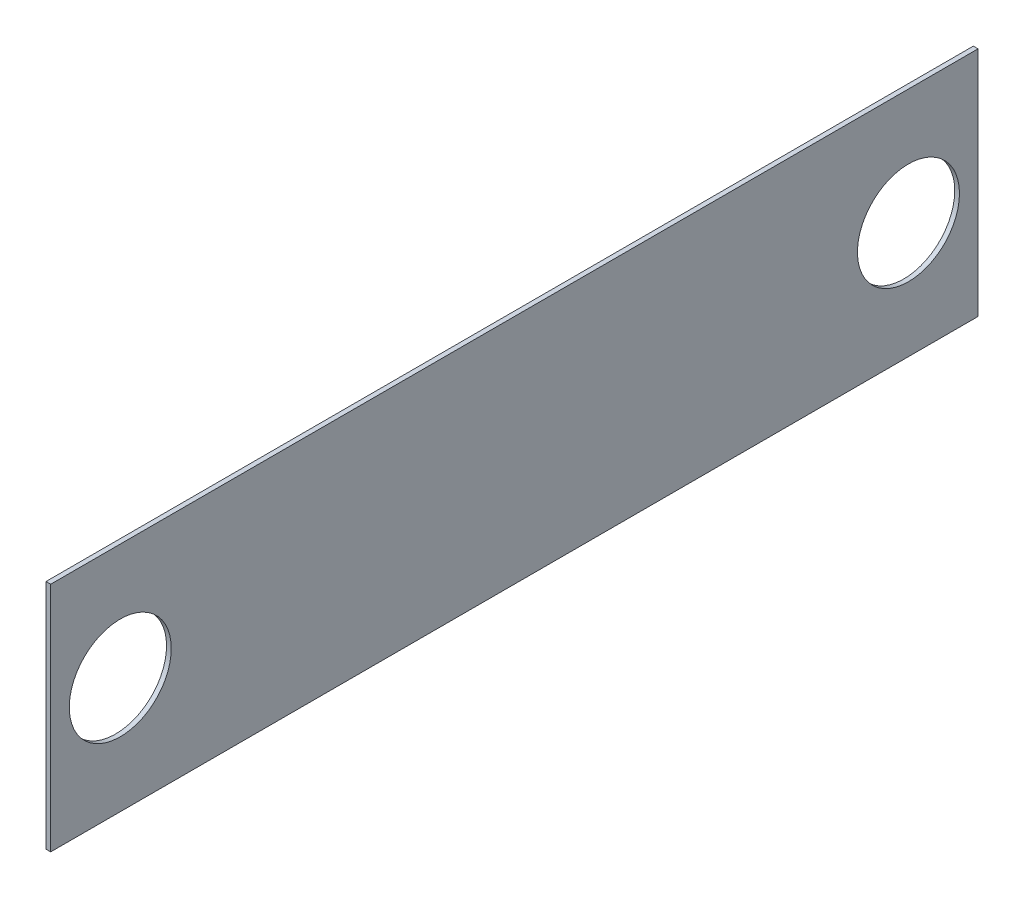
ISO-10303-21;
HEADER;
FILE_DESCRIPTION(('STEP AP214'),'2;1');
FILE_NAME('part.step','',(''),(''),'','','');
FILE_SCHEMA(('AUTOMOTIVE_DESIGN { 1 0 10303 214 1 1 1 1 }'));
ENDSEC;
DATA;
#1=APPLICATION_CONTEXT('core data for automotive mechanical design processes');
#2=APPLICATION_PROTOCOL_DEFINITION('international standard','automotive_design',2000,#1);
#3=PRODUCT_CONTEXT('',#1,'mechanical');
#4=PRODUCT('Part','Part','',(#3));
#5=PRODUCT_RELATED_PRODUCT_CATEGORY('part','',(#4));
#6=PRODUCT_DEFINITION_FORMATION('','',#4);
#7=PRODUCT_DEFINITION_CONTEXT('part definition',#1,'design');
#8=PRODUCT_DEFINITION('design','',#6,#7);
#9=PRODUCT_DEFINITION_SHAPE('','',#8);
#10=(LENGTH_UNIT() NAMED_UNIT(*) SI_UNIT(.MILLI.,.METRE.));
#11=(NAMED_UNIT(*) PLANE_ANGLE_UNIT() SI_UNIT($,.RADIAN.));
#12=(NAMED_UNIT(*) SI_UNIT($,.STERADIAN.) SOLID_ANGLE_UNIT());
#13=UNCERTAINTY_MEASURE_WITH_UNIT(LENGTH_MEASURE(1.E-05),#10,'distance_accuracy_value','');
#14=(GEOMETRIC_REPRESENTATION_CONTEXT(3) GLOBAL_UNCERTAINTY_ASSIGNED_CONTEXT((#13)) GLOBAL_UNIT_ASSIGNED_CONTEXT((#10,
#11,#12)) REPRESENTATION_CONTEXT('',''));
#15=CARTESIAN_POINT('',(0.,0.,0.));
#16=DIRECTION('',(0.,0.,1.));
#17=DIRECTION('',(1.,0.,0.));
#18=AXIS2_PLACEMENT_3D('',#15,#16,#17);
#19=CARTESIAN_POINT('',(0.508,12.5,50.));
#20=DIRECTION('',(0.,0.,-1.));
#21=DIRECTION('',(-1.,0.,0.));
#22=AXIS2_PLACEMENT_3D('',#19,#20,#21);
#23=PLANE('',#22);
#24=DIRECTION('',(0.,-1.,0.));
#25=VECTOR('',#24,1.);
#26=CARTESIAN_POINT('',(0.,12.5,50.));
#27=LINE('',#26,#25);
#28=CARTESIAN_POINT('',(0.,12.5,50.));
#29=VERTEX_POINT('',#28);
#30=CARTESIAN_POINT('',(0.,-12.5,50.));
#31=VERTEX_POINT('',#30);
#32=EDGE_CURVE('E97',#29,#31,#27,.T.);
#33=ORIENTED_EDGE('',*,*,#32,.T.);
#34=DIRECTION('',(-1.,0.,0.));
#35=VECTOR('',#34,1.);
#36=CARTESIAN_POINT('',(0.508,-12.5,50.));
#37=LINE('',#36,#35);
#38=CARTESIAN_POINT('',(0.508,-12.5,50.));
#39=VERTEX_POINT('',#38);
#40=EDGE_CURVE('E11',#39,#31,#37,.T.);
#41=ORIENTED_EDGE('',*,*,#40,.F.);
#42=DIRECTION('',(0.,-1.,0.));
#43=VECTOR('',#42,1.);
#44=CARTESIAN_POINT('',(0.508,12.5,50.));
#45=LINE('',#44,#43);
#46=CARTESIAN_POINT('',(0.508,12.5,50.));
#47=VERTEX_POINT('',#46);
#48=EDGE_CURVE('E85',#47,#39,#45,.T.);
#49=ORIENTED_EDGE('',*,*,#48,.F.);
#50=DIRECTION('',(-1.,0.,0.));
#51=VECTOR('',#50,1.);
#52=CARTESIAN_POINT('',(0.508,12.5,50.));
#53=LINE('',#52,#51);
#54=EDGE_CURVE('E93',#47,#29,#53,.T.);
#55=ORIENTED_EDGE('',*,*,#54,.T.);
#56=EDGE_LOOP('',(#33,#41,#49,#55));
#57=FACE_BOUND('',#56,.T.);
#58=ADVANCED_FACE('F34',(#57),#23,.F.);
#59=CARTESIAN_POINT('',(0.508,-12.5,50.));
#60=DIRECTION('',(0.,1.,0.));
#61=DIRECTION('',(0.,0.,1.));
#62=AXIS2_PLACEMENT_3D('',#59,#60,#61);
#63=PLANE('',#62);
#64=DIRECTION('',(0.,0.,-1.));
#65=VECTOR('',#64,1.);
#66=CARTESIAN_POINT('',(0.,-12.5,50.));
#67=LINE('',#66,#65);
#68=CARTESIAN_POINT('',(0.,-12.5,-50.));
#69=VERTEX_POINT('',#68);
#70=EDGE_CURVE('E89',#31,#69,#67,.T.);
#71=ORIENTED_EDGE('',*,*,#70,.T.);
#72=DIRECTION('',(-1.,0.,0.));
#73=VECTOR('',#72,1.);
#74=CARTESIAN_POINT('',(0.508,-12.5,-50.));
#75=LINE('',#74,#73);
#76=CARTESIAN_POINT('',(0.508,-12.5,-50.));
#77=VERTEX_POINT('',#76);
#78=EDGE_CURVE('E42',#77,#69,#75,.T.);
#79=ORIENTED_EDGE('',*,*,#78,.F.);
#80=DIRECTION('',(0.,0.,-1.));
#81=VECTOR('',#80,1.);
#82=CARTESIAN_POINT('',(0.508,-12.5,50.));
#83=LINE('',#82,#81);
#84=EDGE_CURVE('E80',#39,#77,#83,.T.);
#85=ORIENTED_EDGE('',*,*,#84,.F.);
#86=ORIENTED_EDGE('',*,*,#40,.T.);
#87=EDGE_LOOP('',(#71,#79,#85,#86));
#88=FACE_BOUND('',#87,.T.);
#89=ADVANCED_FACE('F88',(#88),#63,.F.);
#90=CARTESIAN_POINT('',(0.508,12.5,-50.));
#91=DIRECTION('',(0.,0.,1.));
#92=DIRECTION('',(1.,0.,0.));
#93=AXIS2_PLACEMENT_3D('',#90,#91,#92);
#94=PLANE('',#93);
#95=DIRECTION('',(0.,1.,0.));
#96=VECTOR('',#95,1.);
#97=CARTESIAN_POINT('',(0.,12.5,-50.));
#98=LINE('',#97,#96);
#99=CARTESIAN_POINT('',(0.,12.5,-50.));
#100=VERTEX_POINT('',#99);
#101=EDGE_CURVE('E67',#69,#100,#98,.T.);
#102=ORIENTED_EDGE('',*,*,#101,.T.);
#103=DIRECTION('',(-1.,0.,0.));
#104=VECTOR('',#103,1.);
#105=CARTESIAN_POINT('',(0.508,12.5,-50.));
#106=LINE('',#105,#104);
#107=CARTESIAN_POINT('',(0.508,12.5,-50.));
#108=VERTEX_POINT('',#107);
#109=EDGE_CURVE('E90',#108,#100,#106,.T.);
#110=ORIENTED_EDGE('',*,*,#109,.F.);
#111=DIRECTION('',(0.,1.,0.));
#112=VECTOR('',#111,1.);
#113=CARTESIAN_POINT('',(0.508,12.5,-50.));
#114=LINE('',#113,#112);
#115=EDGE_CURVE('E83',#77,#108,#114,.T.);
#116=ORIENTED_EDGE('',*,*,#115,.F.);
#117=ORIENTED_EDGE('',*,*,#78,.T.);
#118=EDGE_LOOP('',(#102,#110,#116,#117));
#119=FACE_BOUND('',#118,.T.);
#120=ADVANCED_FACE('F91',(#119),#94,.F.);
#121=CARTESIAN_POINT('',(0.508,12.5,50.));
#122=DIRECTION('',(0.,-1.,0.));
#123=DIRECTION('',(0.,0.,-1.));
#124=AXIS2_PLACEMENT_3D('',#121,#122,#123);
#125=PLANE('',#124);
#126=DIRECTION('',(0.,0.,1.));
#127=VECTOR('',#126,1.);
#128=CARTESIAN_POINT('',(0.,12.5,50.));
#129=LINE('',#128,#127);
#130=EDGE_CURVE('E73',#100,#29,#129,.T.);
#131=ORIENTED_EDGE('',*,*,#130,.T.);
#132=ORIENTED_EDGE('',*,*,#54,.F.);
#133=DIRECTION('',(0.,0.,1.));
#134=VECTOR('',#133,1.);
#135=CARTESIAN_POINT('',(0.508,12.5,50.));
#136=LINE('',#135,#134);
#137=EDGE_CURVE('E50',#108,#47,#136,.T.);
#138=ORIENTED_EDGE('',*,*,#137,.F.);
#139=ORIENTED_EDGE('',*,*,#109,.T.);
#140=EDGE_LOOP('',(#131,#132,#138,#139));
#141=FACE_BOUND('',#140,.T.);
#142=ADVANCED_FACE('F105',(#141),#125,.F.);
#143=CARTESIAN_POINT('',(0.508,0.,0.));
#144=DIRECTION('',(1.,0.,0.));
#145=DIRECTION('',(0.,0.,-1.));
#146=AXIS2_PLACEMENT_3D('',#143,#144,#145);
#147=PLANE('',#146);
#148=CARTESIAN_POINT('',(0.508000000000001,0.,42.5));
#149=DIRECTION('',(1.,0.,0.));
#150=DIRECTION('',(0.,0.,-1.));
#151=AXIS2_PLACEMENT_3D('',#148,#149,#150);
#152=CIRCLE('',#151,5.5);
#153=CARTESIAN_POINT('',(0.508000000000001,0.,37.));
#154=VERTEX_POINT('',#153);
#155=EDGE_CURVE('E119',#154,#154,#152,.T.);
#156=ORIENTED_EDGE('',*,*,#155,.F.);
#157=EDGE_LOOP('',(#156));
#158=FACE_BOUND('',#157,.T.);
#159=CARTESIAN_POINT('',(0.508000000000001,0.,-42.5));
#160=DIRECTION('',(1.,0.,0.));
#161=DIRECTION('',(0.,0.,-1.));
#162=AXIS2_PLACEMENT_3D('',#159,#160,#161);
#163=CIRCLE('',#162,5.5);
#164=CARTESIAN_POINT('',(0.508000000000001,0.,-48.));
#165=VERTEX_POINT('',#164);
#166=EDGE_CURVE('E113',#165,#165,#163,.T.);
#167=ORIENTED_EDGE('',*,*,#166,.F.);
#168=EDGE_LOOP('',(#167));
#169=FACE_BOUND('',#168,.T.);
#170=ORIENTED_EDGE('',*,*,#48,.T.);
#171=ORIENTED_EDGE('',*,*,#84,.T.);
#172=ORIENTED_EDGE('',*,*,#115,.T.);
#173=ORIENTED_EDGE('',*,*,#137,.T.);
#174=EDGE_LOOP('',(#170,#171,#172,#173));
#175=FACE_BOUND('',#174,.T.);
#176=ADVANCED_FACE('F81',(#158,#169,#175),#147,.T.);
#177=CARTESIAN_POINT('',(0.,0.,0.));
#178=DIRECTION('',(1.,0.,0.));
#179=DIRECTION('',(0.,0.,-1.));
#180=AXIS2_PLACEMENT_3D('',#177,#178,#179);
#181=PLANE('',#180);
#182=CARTESIAN_POINT('',(0.,0.,42.5));
#183=DIRECTION('',(1.,0.,0.));
#184=DIRECTION('',(0.,0.,-1.));
#185=AXIS2_PLACEMENT_3D('',#182,#183,#184);
#186=CIRCLE('',#185,5.5);
#187=CARTESIAN_POINT('',(0.,0.,37.));
#188=VERTEX_POINT('',#187);
#189=EDGE_CURVE('E116',#188,#188,#186,.T.);
#190=ORIENTED_EDGE('',*,*,#189,.T.);
#191=EDGE_LOOP('',(#190));
#192=FACE_BOUND('',#191,.T.);
#193=CARTESIAN_POINT('',(0.,0.,-42.5));
#194=DIRECTION('',(1.,0.,0.));
#195=DIRECTION('',(0.,0.,-1.));
#196=AXIS2_PLACEMENT_3D('',#193,#194,#195);
#197=CIRCLE('',#196,5.5);
#198=CARTESIAN_POINT('',(0.,0.,-48.));
#199=VERTEX_POINT('',#198);
#200=EDGE_CURVE('E100',#199,#199,#197,.T.);
#201=ORIENTED_EDGE('',*,*,#200,.T.);
#202=EDGE_LOOP('',(#201));
#203=FACE_BOUND('',#202,.T.);
#204=ORIENTED_EDGE('',*,*,#32,.F.);
#205=ORIENTED_EDGE('',*,*,#130,.F.);
#206=ORIENTED_EDGE('',*,*,#101,.F.);
#207=ORIENTED_EDGE('',*,*,#70,.F.);
#208=EDGE_LOOP('',(#204,#205,#206,#207));
#209=FACE_BOUND('',#208,.T.);
#210=ADVANCED_FACE('F108',(#192,#203,#209),#181,.F.);
#211=CARTESIAN_POINT('',(0.508,0.,-42.5));
#212=DIRECTION('',(1.,0.,0.));
#213=DIRECTION('',(0.,0.,-1.));
#214=AXIS2_PLACEMENT_3D('',#211,#212,#213);
#215=CYLINDRICAL_SURFACE('',#214,5.5);
#216=ORIENTED_EDGE('',*,*,#200,.F.);
#217=EDGE_LOOP('',(#216));
#218=FACE_BOUND('',#217,.T.);
#219=ORIENTED_EDGE('',*,*,#166,.T.);
#220=EDGE_LOOP('',(#219));
#221=FACE_BOUND('',#220,.T.);
#222=ADVANCED_FACE('F130',(#218,#221),#215,.F.);
#223=CARTESIAN_POINT('',(0.508,0.,42.5));
#224=DIRECTION('',(1.,0.,0.));
#225=DIRECTION('',(0.,0.,-1.));
#226=AXIS2_PLACEMENT_3D('',#223,#224,#225);
#227=CYLINDRICAL_SURFACE('',#226,5.5);
#228=ORIENTED_EDGE('',*,*,#189,.F.);
#229=EDGE_LOOP('',(#228));
#230=FACE_BOUND('',#229,.T.);
#231=ORIENTED_EDGE('',*,*,#155,.T.);
#232=EDGE_LOOP('',(#231));
#233=FACE_BOUND('',#232,.T.);
#234=ADVANCED_FACE('F123',(#230,#233),#227,.F.);
#235=CLOSED_SHELL('',(#58,#89,#120,#142,#176,#210,#222,#234));
#236=MANIFOLD_SOLID_BREP('B2',#235);
#237=ADVANCED_BREP_SHAPE_REPRESENTATION('',(#18,#236),#14);
#238=SHAPE_DEFINITION_REPRESENTATION(#9,#237);
ENDSEC;
END-ISO-10303-21;
